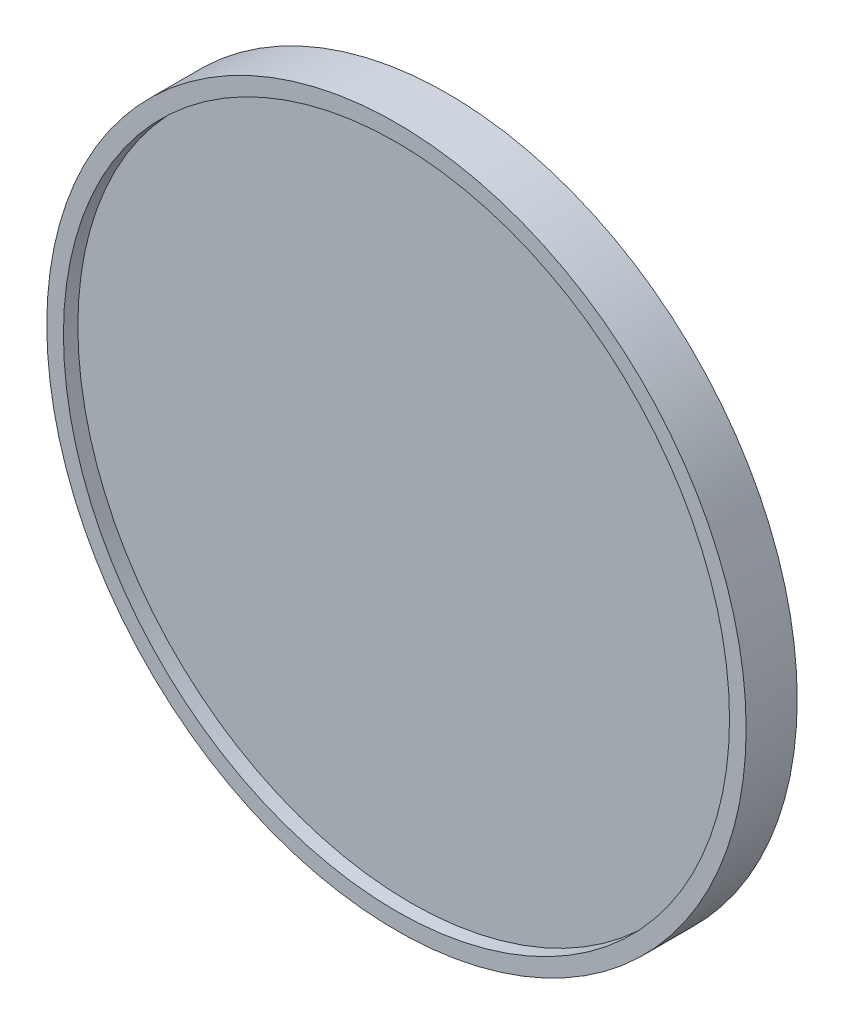
ISO-10303-21;
HEADER;
FILE_DESCRIPTION(('STEP AP214'),'2;1');
FILE_NAME('part.step','',(''),(''),'','','');
FILE_SCHEMA(('AUTOMOTIVE_DESIGN { 1 0 10303 214 1 1 1 1 }'));
ENDSEC;
DATA;
#1=APPLICATION_CONTEXT('core data for automotive mechanical design processes');
#2=APPLICATION_PROTOCOL_DEFINITION('international standard','automotive_design',2000,#1);
#3=PRODUCT_CONTEXT('',#1,'mechanical');
#4=PRODUCT('Part','Part','',(#3));
#5=PRODUCT_RELATED_PRODUCT_CATEGORY('part','',(#4));
#6=PRODUCT_DEFINITION_FORMATION('','',#4);
#7=PRODUCT_DEFINITION_CONTEXT('part definition',#1,'design');
#8=PRODUCT_DEFINITION('design','',#6,#7);
#9=PRODUCT_DEFINITION_SHAPE('','',#8);
#10=(LENGTH_UNIT() NAMED_UNIT(*) SI_UNIT(.MILLI.,.METRE.));
#11=(NAMED_UNIT(*) PLANE_ANGLE_UNIT() SI_UNIT($,.RADIAN.));
#12=(NAMED_UNIT(*) SI_UNIT($,.STERADIAN.) SOLID_ANGLE_UNIT());
#13=UNCERTAINTY_MEASURE_WITH_UNIT(LENGTH_MEASURE(1.E-05),#10,'distance_accuracy_value','');
#14=(GEOMETRIC_REPRESENTATION_CONTEXT(3) GLOBAL_UNCERTAINTY_ASSIGNED_CONTEXT((#13)) GLOBAL_UNIT_ASSIGNED_CONTEXT((#10,
#11,#12)) REPRESENTATION_CONTEXT('',''));
#15=CARTESIAN_POINT('',(0.,0.,0.));
#16=DIRECTION('',(0.,0.,1.));
#17=DIRECTION('',(1.,0.,0.));
#18=AXIS2_PLACEMENT_3D('',#15,#16,#17);
#19=CARTESIAN_POINT('',(0.,0.,2.));
#20=DIRECTION('',(0.,0.,-1.));
#21=DIRECTION('',(-1.,0.,0.));
#22=AXIS2_PLACEMENT_3D('',#19,#20,#21);
#23=CYLINDRICAL_SURFACE('',#22,31.5);
#24=CARTESIAN_POINT('',(0.,0.,3.3));
#25=DIRECTION('',(0.,0.,1.));
#26=DIRECTION('',(1.,0.,0.));
#27=AXIS2_PLACEMENT_3D('',#24,#25,#26);
#28=CIRCLE('',#27,31.5);
#29=CARTESIAN_POINT('',(31.5,0.,3.3));
#30=VERTEX_POINT('',#29);
#31=EDGE_CURVE('E37',#30,#30,#28,.T.);
#32=ORIENTED_EDGE('',*,*,#31,.F.);
#33=EDGE_LOOP('',(#32));
#34=FACE_BOUND('',#33,.T.);
#35=CARTESIAN_POINT('',(0.,0.,-1.3));
#36=DIRECTION('',(0.,0.,-1.));
#37=DIRECTION('',(-1.,0.,0.));
#38=AXIS2_PLACEMENT_3D('',#35,#36,#37);
#39=CIRCLE('',#38,31.5);
#40=CARTESIAN_POINT('',(-31.5,0.,-1.3));
#41=VERTEX_POINT('',#40);
#42=EDGE_CURVE('E45',#41,#41,#39,.T.);
#43=ORIENTED_EDGE('',*,*,#42,.F.);
#44=EDGE_LOOP('',(#43));
#45=FACE_BOUND('',#44,.T.);
#46=ADVANCED_FACE('F31',(#34,#45),#23,.T.);
#47=CARTESIAN_POINT('',(0.,0.,3.3));
#48=DIRECTION('',(0.,0.,1.));
#49=DIRECTION('',(1.,0.,0.));
#50=AXIS2_PLACEMENT_3D('',#47,#48,#49);
#51=PLANE('',#50);
#52=ORIENTED_EDGE('',*,*,#31,.T.);
#53=EDGE_LOOP('',(#52));
#54=FACE_BOUND('',#53,.T.);
#55=CARTESIAN_POINT('',(0.,0.,3.3));
#56=DIRECTION('',(0.,0.,1.));
#57=DIRECTION('',(1.,0.,0.));
#58=AXIS2_PLACEMENT_3D('',#55,#56,#57);
#59=CIRCLE('',#58,30.);
#60=CARTESIAN_POINT('',(30.,0.,3.3));
#61=VERTEX_POINT('',#60);
#62=EDGE_CURVE('E41',#61,#61,#59,.T.);
#63=ORIENTED_EDGE('',*,*,#62,.F.);
#64=EDGE_LOOP('',(#63));
#65=FACE_BOUND('',#64,.T.);
#66=ADVANCED_FACE('F76',(#54,#65),#51,.T.);
#67=CARTESIAN_POINT('',(0.,0.,3.3));
#68=DIRECTION('',(0.,0.,-1.));
#69=DIRECTION('',(-1.,0.,0.));
#70=AXIS2_PLACEMENT_3D('',#67,#68,#69);
#71=CYLINDRICAL_SURFACE('',#70,30.);
#72=ORIENTED_EDGE('',*,*,#62,.T.);
#73=EDGE_LOOP('',(#72));
#74=FACE_BOUND('',#73,.T.);
#75=CARTESIAN_POINT('',(0.,0.,2.));
#76=DIRECTION('',(0.,0.,1.));
#77=DIRECTION('',(1.,0.,0.));
#78=AXIS2_PLACEMENT_3D('',#75,#76,#77);
#79=CIRCLE('',#78,30.);
#80=CARTESIAN_POINT('',(30.,0.,2.));
#81=VERTEX_POINT('',#80);
#82=EDGE_CURVE('E10',#81,#81,#79,.F.);
#83=ORIENTED_EDGE('',*,*,#82,.T.);
#84=EDGE_LOOP('',(#83));
#85=FACE_BOUND('',#84,.T.);
#86=ADVANCED_FACE('F71',(#74,#85),#71,.F.);
#87=CARTESIAN_POINT('',(0.,0.,2.));
#88=DIRECTION('',(0.,0.,1.));
#89=DIRECTION('',(1.,0.,0.));
#90=AXIS2_PLACEMENT_3D('',#87,#88,#89);
#91=PLANE('',#90);
#92=ORIENTED_EDGE('',*,*,#82,.F.);
#93=EDGE_LOOP('',(#92));
#94=FACE_BOUND('',#93,.T.);
#95=ADVANCED_FACE('F62',(#94),#91,.T.);
#96=CARTESIAN_POINT('',(0.,0.,-1.3));
#97=DIRECTION('',(0.,0.,-1.));
#98=DIRECTION('',(-1.,0.,0.));
#99=AXIS2_PLACEMENT_3D('',#96,#97,#98);
#100=PLANE('',#99);
#101=ORIENTED_EDGE('',*,*,#42,.T.);
#102=EDGE_LOOP('',(#101));
#103=FACE_BOUND('',#102,.T.);
#104=CARTESIAN_POINT('',(0.,0.,-1.3));
#105=DIRECTION('',(0.,0.,-1.));
#106=DIRECTION('',(-1.,0.,0.));
#107=AXIS2_PLACEMENT_3D('',#104,#105,#106);
#108=CIRCLE('',#107,30.);
#109=CARTESIAN_POINT('',(-30.,0.,-1.3));
#110=VERTEX_POINT('',#109);
#111=EDGE_CURVE('E50',#110,#110,#108,.T.);
#112=ORIENTED_EDGE('',*,*,#111,.F.);
#113=EDGE_LOOP('',(#112));
#114=FACE_BOUND('',#113,.T.);
#115=ADVANCED_FACE('F60',(#103,#114),#100,.T.);
#116=CARTESIAN_POINT('',(0.,0.,-1.3));
#117=DIRECTION('',(0.,0.,1.));
#118=DIRECTION('',(1.,0.,0.));
#119=AXIS2_PLACEMENT_3D('',#116,#117,#118);
#120=CYLINDRICAL_SURFACE('',#119,30.);
#121=ORIENTED_EDGE('',*,*,#111,.T.);
#122=EDGE_LOOP('',(#121));
#123=FACE_BOUND('',#122,.T.);
#124=CARTESIAN_POINT('',(0.,0.,0.));
#125=DIRECTION('',(0.,0.,-1.));
#126=DIRECTION('',(-1.,0.,0.));
#127=AXIS2_PLACEMENT_3D('',#124,#125,#126);
#128=CIRCLE('',#127,30.);
#129=CARTESIAN_POINT('',(-30.,0.,0.));
#130=VERTEX_POINT('',#129);
#131=EDGE_CURVE('E51',#130,#130,#128,.T.);
#132=ORIENTED_EDGE('',*,*,#131,.F.);
#133=EDGE_LOOP('',(#132));
#134=FACE_BOUND('',#133,.T.);
#135=ADVANCED_FACE('F57',(#123,#134),#120,.F.);
#136=CARTESIAN_POINT('',(0.,0.,0.));
#137=DIRECTION('',(0.,0.,1.));
#138=DIRECTION('',(1.,0.,0.));
#139=AXIS2_PLACEMENT_3D('',#136,#137,#138);
#140=PLANE('',#139);
#141=ORIENTED_EDGE('',*,*,#131,.T.);
#142=EDGE_LOOP('',(#141));
#143=FACE_BOUND('',#142,.T.);
#144=ADVANCED_FACE('F69',(#143),#140,.F.);
#145=CLOSED_SHELL('',(#46,#66,#86,#95,#115,#135,#144));
#146=MANIFOLD_SOLID_BREP('B2',#145);
#147=ADVANCED_BREP_SHAPE_REPRESENTATION('',(#18,#146),#14);
#148=SHAPE_DEFINITION_REPRESENTATION(#9,#147);
ENDSEC;
END-ISO-10303-21;
